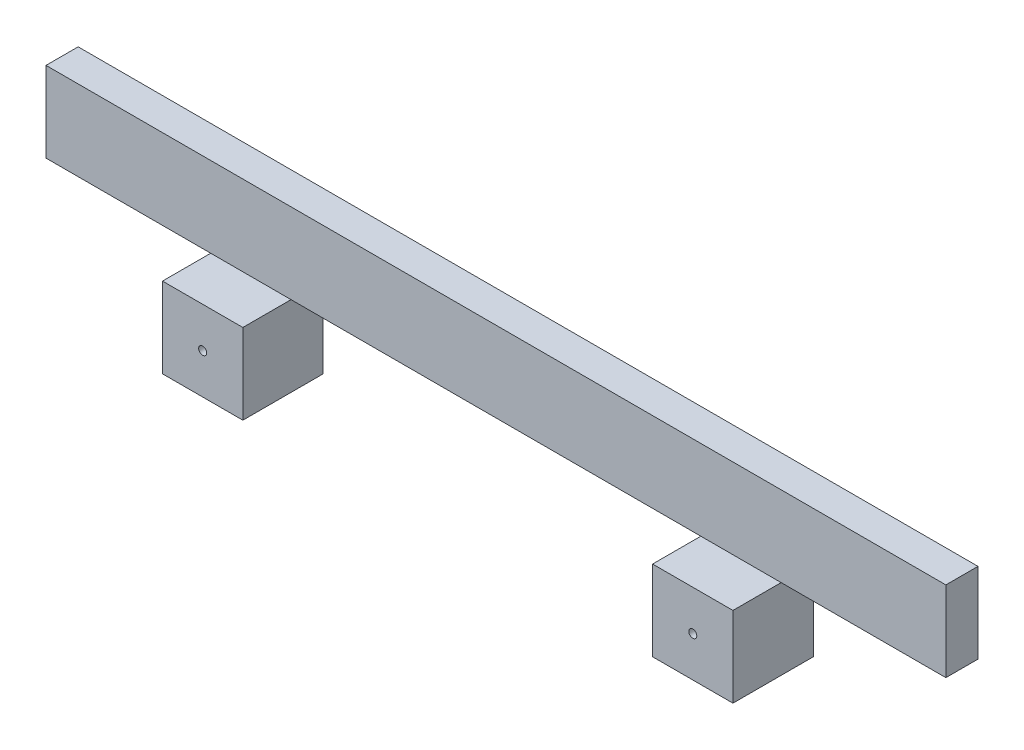
ISO-10303-21;
HEADER;
FILE_DESCRIPTION(('STEP AP214'),'2;1');
FILE_NAME('part.step','',(''),(''),'','','');
FILE_SCHEMA(('AUTOMOTIVE_DESIGN { 1 0 10303 214 1 1 1 1 }'));
ENDSEC;
DATA;
#1=APPLICATION_CONTEXT('core data for automotive mechanical design processes');
#2=APPLICATION_PROTOCOL_DEFINITION('international standard','automotive_design',2000,#1);
#3=PRODUCT_CONTEXT('',#1,'mechanical');
#4=PRODUCT('Part','Part','',(#3));
#5=PRODUCT_RELATED_PRODUCT_CATEGORY('part','',(#4));
#6=PRODUCT_DEFINITION_FORMATION('','',#4);
#7=PRODUCT_DEFINITION_CONTEXT('part definition',#1,'design');
#8=PRODUCT_DEFINITION('design','',#6,#7);
#9=PRODUCT_DEFINITION_SHAPE('','',#8);
#10=(LENGTH_UNIT() NAMED_UNIT(*) SI_UNIT(.MILLI.,.METRE.));
#11=(NAMED_UNIT(*) PLANE_ANGLE_UNIT() SI_UNIT($,.RADIAN.));
#12=(NAMED_UNIT(*) SI_UNIT($,.STERADIAN.) SOLID_ANGLE_UNIT());
#13=UNCERTAINTY_MEASURE_WITH_UNIT(LENGTH_MEASURE(1.E-05),#10,'distance_accuracy_value','');
#14=(GEOMETRIC_REPRESENTATION_CONTEXT(3) GLOBAL_UNCERTAINTY_ASSIGNED_CONTEXT((#13)) GLOBAL_UNIT_ASSIGNED_CONTEXT((#10,
#11,#12)) REPRESENTATION_CONTEXT('',''));
#15=CARTESIAN_POINT('',(0.,0.,0.));
#16=DIRECTION('',(0.,0.,1.));
#17=DIRECTION('',(1.,0.,0.));
#18=AXIS2_PLACEMENT_3D('',#15,#16,#17);
#19=CARTESIAN_POINT('',(0.,0.,10.));
#20=DIRECTION('',(0.,1.,0.));
#21=DIRECTION('',(0.,0.,1.));
#22=AXIS2_PLACEMENT_3D('',#19,#20,#21);
#23=PLANE('',#22);
#24=DIRECTION('',(0.,0.,-1.));
#25=VECTOR('',#24,1.);
#26=CARTESIAN_POINT('',(203.75,0.,25.));
#27=LINE('',#26,#25);
#28=CARTESIAN_POINT('',(203.75,0.,10.));
#29=VERTEX_POINT('',#28);
#30=CARTESIAN_POINT('',(203.75,0.,0.));
#31=VERTEX_POINT('',#30);
#32=EDGE_CURVE('E181',#29,#31,#27,.T.);
#33=ORIENTED_EDGE('',*,*,#32,.F.);
#34=DIRECTION('',(1.,0.,0.));
#35=VECTOR('',#34,1.);
#36=CARTESIAN_POINT('',(0.,0.,10.));
#37=LINE('',#36,#35);
#38=CARTESIAN_POINT('',(76.25,0.,10.));
#39=VERTEX_POINT('',#38);
#40=EDGE_CURVE('E48',#39,#29,#37,.T.);
#41=ORIENTED_EDGE('',*,*,#40,.F.);
#42=DIRECTION('',(0.,0.,-1.));
#43=VECTOR('',#42,1.);
#44=CARTESIAN_POINT('',(76.25,0.,25.));
#45=LINE('',#44,#43);
#46=CARTESIAN_POINT('',(76.25,0.,0.));
#47=VERTEX_POINT('',#46);
#48=EDGE_CURVE('E241',#39,#47,#45,.T.);
#49=ORIENTED_EDGE('',*,*,#48,.T.);
#50=DIRECTION('',(1.,0.,0.));
#51=VECTOR('',#50,1.);
#52=CARTESIAN_POINT('',(0.,0.,0.));
#53=LINE('',#52,#51);
#54=EDGE_CURVE('E200',#47,#31,#53,.T.);
#55=ORIENTED_EDGE('',*,*,#54,.T.);
#56=EDGE_LOOP('',(#33,#41,#49,#55));
#57=FACE_BOUND('',#56,.T.);
#58=ADVANCED_FACE('F35',(#57),#23,.F.);
#59=CARTESIAN_POINT('',(76.25,0.,25.));
#60=DIRECTION('',(1.,0.,0.));
#61=DIRECTION('',(0.,0.,-1.));
#62=AXIS2_PLACEMENT_3D('',#59,#60,#61);
#63=PLANE('',#62);
#64=DIRECTION('',(0.,-1.,0.));
#65=VECTOR('',#64,1.);
#66=CARTESIAN_POINT('',(76.25,0.,0.));
#67=LINE('',#66,#65);
#68=CARTESIAN_POINT('',(76.25,-25.,0.));
#69=VERTEX_POINT('',#68);
#70=EDGE_CURVE('E243',#47,#69,#67,.T.);
#71=ORIENTED_EDGE('',*,*,#70,.F.);
#72=ORIENTED_EDGE('',*,*,#48,.F.);
#73=CARTESIAN_POINT('',(76.25,0.,25.));
#74=VERTEX_POINT('',#73);
#75=EDGE_CURVE('E45',#74,#39,#45,.T.);
#76=ORIENTED_EDGE('',*,*,#75,.F.);
#77=DIRECTION('',(0.,-1.,0.));
#78=VECTOR('',#77,1.);
#79=CARTESIAN_POINT('',(76.25,0.,25.));
#80=LINE('',#79,#78);
#81=CARTESIAN_POINT('',(76.25,-25.,25.));
#82=VERTEX_POINT('',#81);
#83=EDGE_CURVE('E294',#74,#82,#80,.T.);
#84=ORIENTED_EDGE('',*,*,#83,.T.);
#85=DIRECTION('',(0.,0.,-1.));
#86=VECTOR('',#85,1.);
#87=CARTESIAN_POINT('',(76.25,-25.,25.));
#88=LINE('',#87,#86);
#89=EDGE_CURVE('E270',#82,#69,#88,.T.);
#90=ORIENTED_EDGE('',*,*,#89,.T.);
#91=EDGE_LOOP('',(#71,#72,#76,#84,#90));
#92=FACE_BOUND('',#91,.T.);
#93=ADVANCED_FACE('F315',(#92),#63,.T.);
#94=CARTESIAN_POINT('',(0.,0.,25.));
#95=DIRECTION('',(0.,1.,0.));
#96=DIRECTION('',(0.,0.,1.));
#97=AXIS2_PLACEMENT_3D('',#94,#95,#96);
#98=PLANE('',#97);
#99=CARTESIAN_POINT('',(51.25,0.,10.));
#100=VERTEX_POINT('',#99);
#101=EDGE_CURVE('E11',#100,#39,#37,.T.);
#102=ORIENTED_EDGE('',*,*,#101,.F.);
#103=DIRECTION('',(0.,0.,-1.));
#104=VECTOR('',#103,1.);
#105=CARTESIAN_POINT('',(51.25,0.,25.));
#106=LINE('',#105,#104);
#107=CARTESIAN_POINT('',(51.25,0.,25.));
#108=VERTEX_POINT('',#107);
#109=EDGE_CURVE('E265',#108,#100,#106,.T.);
#110=ORIENTED_EDGE('',*,*,#109,.F.);
#111=DIRECTION('',(1.,0.,0.));
#112=VECTOR('',#111,1.);
#113=CARTESIAN_POINT('',(0.,0.,25.));
#114=LINE('',#113,#112);
#115=EDGE_CURVE('E291',#108,#74,#114,.T.);
#116=ORIENTED_EDGE('',*,*,#115,.T.);
#117=ORIENTED_EDGE('',*,*,#75,.T.);
#118=EDGE_LOOP('',(#102,#110,#116,#117));
#119=FACE_BOUND('',#118,.T.);
#120=ADVANCED_FACE('F310',(#119),#98,.T.);
#121=CARTESIAN_POINT('',(51.25,0.,25.));
#122=DIRECTION('',(1.,0.,0.));
#123=DIRECTION('',(0.,1.,0.));
#124=AXIS2_PLACEMENT_3D('',#121,#122,#123);
#125=PLANE('',#124);
#126=DIRECTION('',(0.,-1.,0.));
#127=VECTOR('',#126,1.);
#128=CARTESIAN_POINT('',(51.25,0.,0.));
#129=LINE('',#128,#127);
#130=CARTESIAN_POINT('',(51.25,0.,0.));
#131=VERTEX_POINT('',#130);
#132=CARTESIAN_POINT('',(51.25,-25.,0.));
#133=VERTEX_POINT('',#132);
#134=EDGE_CURVE('E275',#131,#133,#129,.T.);
#135=ORIENTED_EDGE('',*,*,#134,.T.);
#136=DIRECTION('',(0.,0.,-1.));
#137=VECTOR('',#136,1.);
#138=CARTESIAN_POINT('',(51.25,-25.,25.));
#139=LINE('',#138,#137);
#140=CARTESIAN_POINT('',(51.25,-25.,25.));
#141=VERTEX_POINT('',#140);
#142=EDGE_CURVE('E266',#141,#133,#139,.T.);
#143=ORIENTED_EDGE('',*,*,#142,.F.);
#144=DIRECTION('',(0.,-1.,0.));
#145=VECTOR('',#144,1.);
#146=CARTESIAN_POINT('',(51.25,0.,25.));
#147=LINE('',#146,#145);
#148=EDGE_CURVE('E288',#108,#141,#147,.T.);
#149=ORIENTED_EDGE('',*,*,#148,.F.);
#150=ORIENTED_EDGE('',*,*,#109,.T.);
#151=EDGE_CURVE('E261',#100,#131,#106,.T.);
#152=ORIENTED_EDGE('',*,*,#151,.T.);
#153=EDGE_LOOP('',(#135,#143,#149,#150,#152));
#154=FACE_BOUND('',#153,.T.);
#155=ADVANCED_FACE('F313',(#154),#125,.F.);
#156=CARTESIAN_POINT('',(63.75,-12.5,25.));
#157=DIRECTION('',(0.,0.,-1.));
#158=DIRECTION('',(-1.,0.,0.));
#159=AXIS2_PLACEMENT_3D('',#156,#157,#158);
#160=CYLINDRICAL_SURFACE('',#159,1.25);
#161=CARTESIAN_POINT('',(63.75,-12.5,25.));
#162=DIRECTION('',(0.,0.,1.));
#163=DIRECTION('',(1.,0.,0.));
#164=AXIS2_PLACEMENT_3D('',#161,#162,#163);
#165=CIRCLE('',#164,1.25);
#166=CARTESIAN_POINT('',(65.,-12.5,25.));
#167=VERTEX_POINT('',#166);
#168=EDGE_CURVE('E284',#167,#167,#165,.T.);
#169=ORIENTED_EDGE('',*,*,#168,.T.);
#170=EDGE_LOOP('',(#169));
#171=FACE_BOUND('',#170,.T.);
#172=CARTESIAN_POINT('',(63.75,-12.5,0.));
#173=DIRECTION('',(0.,0.,1.));
#174=DIRECTION('',(1.,0.,0.));
#175=AXIS2_PLACEMENT_3D('',#172,#173,#174);
#176=CIRCLE('',#175,1.25);
#177=CARTESIAN_POINT('',(65.,-12.5,0.));
#178=VERTEX_POINT('',#177);
#179=EDGE_CURVE('E209',#178,#178,#176,.T.);
#180=ORIENTED_EDGE('',*,*,#179,.F.);
#181=EDGE_LOOP('',(#180));
#182=FACE_BOUND('',#181,.T.);
#183=ADVANCED_FACE('F37',(#171,#182),#160,.F.);
#184=CARTESIAN_POINT('',(0.,-25.,25.));
#185=DIRECTION('',(0.,1.,0.));
#186=DIRECTION('',(-1.,0.,0.));
#187=AXIS2_PLACEMENT_3D('',#184,#185,#186);
#188=PLANE('',#187);
#189=DIRECTION('',(1.,0.,0.));
#190=VECTOR('',#189,1.);
#191=CARTESIAN_POINT('',(0.,-25.,0.));
#192=LINE('',#191,#190);
#193=EDGE_CURVE('E281',#133,#69,#192,.T.);
#194=ORIENTED_EDGE('',*,*,#193,.T.);
#195=ORIENTED_EDGE('',*,*,#89,.F.);
#196=DIRECTION('',(1.,0.,0.));
#197=VECTOR('',#196,1.);
#198=CARTESIAN_POINT('',(0.,-25.,25.));
#199=LINE('',#198,#197);
#200=EDGE_CURVE('E280',#141,#82,#199,.T.);
#201=ORIENTED_EDGE('',*,*,#200,.F.);
#202=ORIENTED_EDGE('',*,*,#142,.T.);
#203=EDGE_LOOP('',(#194,#195,#201,#202));
#204=FACE_BOUND('',#203,.T.);
#205=ADVANCED_FACE('F304',(#204),#188,.F.);
#206=CARTESIAN_POINT('',(0.,0.,25.));
#207=DIRECTION('',(0.,0.,1.));
#208=DIRECTION('',(1.,0.,0.));
#209=AXIS2_PLACEMENT_3D('',#206,#207,#208);
#210=PLANE('',#209);
#211=ORIENTED_EDGE('',*,*,#168,.F.);
#212=EDGE_LOOP('',(#211));
#213=FACE_BOUND('',#212,.T.);
#214=ORIENTED_EDGE('',*,*,#83,.F.);
#215=ORIENTED_EDGE('',*,*,#115,.F.);
#216=ORIENTED_EDGE('',*,*,#148,.T.);
#217=ORIENTED_EDGE('',*,*,#200,.T.);
#218=EDGE_LOOP('',(#214,#215,#216,#217));
#219=FACE_BOUND('',#218,.T.);
#220=ADVANCED_FACE('F301',(#213,#219),#210,.T.);
#221=CARTESIAN_POINT('',(0.,0.,0.));
#222=DIRECTION('',(0.,0.,1.));
#223=DIRECTION('',(1.,0.,0.));
#224=AXIS2_PLACEMENT_3D('',#221,#222,#223);
#225=PLANE('',#224);
#226=ORIENTED_EDGE('',*,*,#179,.T.);
#227=EDGE_LOOP('',(#226));
#228=FACE_BOUND('',#227,.T.);
#229=ORIENTED_EDGE('',*,*,#70,.T.);
#230=ORIENTED_EDGE('',*,*,#193,.F.);
#231=ORIENTED_EDGE('',*,*,#134,.F.);
#232=CARTESIAN_POINT('',(0.,0.,0.));
#233=VERTEX_POINT('',#232);
#234=EDGE_CURVE('E203',#233,#131,#53,.T.);
#235=ORIENTED_EDGE('',*,*,#234,.F.);
#236=DIRECTION('',(0.,1.,0.));
#237=VECTOR('',#236,1.);
#238=CARTESIAN_POINT('',(0.,0.,0.));
#239=LINE('',#238,#237);
#240=CARTESIAN_POINT('',(0.,25.,0.));
#241=VERTEX_POINT('',#240);
#242=EDGE_CURVE('E215',#233,#241,#239,.T.);
#243=ORIENTED_EDGE('',*,*,#242,.T.);
#244=DIRECTION('',(1.,0.,0.));
#245=VECTOR('',#244,1.);
#246=CARTESIAN_POINT('',(0.,25.,0.));
#247=LINE('',#246,#245);
#248=CARTESIAN_POINT('',(280.,25.,0.));
#249=VERTEX_POINT('',#248);
#250=EDGE_CURVE('E217',#241,#249,#247,.T.);
#251=ORIENTED_EDGE('',*,*,#250,.T.);
#252=DIRECTION('',(0.,1.,0.));
#253=VECTOR('',#252,1.);
#254=CARTESIAN_POINT('',(280.,0.,0.));
#255=LINE('',#254,#253);
#256=CARTESIAN_POINT('',(280.,0.,0.));
#257=VERTEX_POINT('',#256);
#258=EDGE_CURVE('E195',#257,#249,#255,.T.);
#259=ORIENTED_EDGE('',*,*,#258,.F.);
#260=CARTESIAN_POINT('',(228.75,0.,0.));
#261=VERTEX_POINT('',#260);
#262=EDGE_CURVE('E39',#261,#257,#53,.T.);
#263=ORIENTED_EDGE('',*,*,#262,.F.);
#264=DIRECTION('',(0.,-1.,0.));
#265=VECTOR('',#264,1.);
#266=CARTESIAN_POINT('',(228.75,0.,0.));
#267=LINE('',#266,#265);
#268=CARTESIAN_POINT('',(228.75,-25.,0.));
#269=VERTEX_POINT('',#268);
#270=EDGE_CURVE('E168',#261,#269,#267,.T.);
#271=ORIENTED_EDGE('',*,*,#270,.T.);
#272=DIRECTION('',(1.,0.,0.));
#273=VECTOR('',#272,1.);
#274=CARTESIAN_POINT('',(0.,-25.,0.));
#275=LINE('',#274,#273);
#276=CARTESIAN_POINT('',(203.75,-25.,0.));
#277=VERTEX_POINT('',#276);
#278=EDGE_CURVE('E174',#277,#269,#275,.T.);
#279=ORIENTED_EDGE('',*,*,#278,.F.);
#280=DIRECTION('',(0.,-1.,0.));
#281=VECTOR('',#280,1.);
#282=CARTESIAN_POINT('',(203.75,0.,0.));
#283=LINE('',#282,#281);
#284=EDGE_CURVE('E171',#31,#277,#283,.T.);
#285=ORIENTED_EDGE('',*,*,#284,.F.);
#286=ORIENTED_EDGE('',*,*,#54,.F.);
#287=EDGE_LOOP('',(#229,#230,#231,#235,#243,#251,#259,#263,#271,#279,#285,#286));
#288=FACE_BOUND('',#287,.T.);
#289=CARTESIAN_POINT('',(216.25,-12.5,0.));
#290=DIRECTION('',(0.,0.,1.));
#291=DIRECTION('',(1.,0.,0.));
#292=AXIS2_PLACEMENT_3D('',#289,#290,#291);
#293=CIRCLE('',#292,1.25000000000001);
#294=CARTESIAN_POINT('',(217.5,-12.5,0.));
#295=VERTEX_POINT('',#294);
#296=EDGE_CURVE('E165',#295,#295,#293,.T.);
#297=ORIENTED_EDGE('',*,*,#296,.T.);
#298=EDGE_LOOP('',(#297));
#299=FACE_BOUND('',#298,.T.);
#300=ADVANCED_FACE('F230',(#228,#288,#299),#225,.F.);
#301=CARTESIAN_POINT('',(228.75,0.,10.));
#302=VERTEX_POINT('',#301);
#303=CARTESIAN_POINT('',(280.,0.,10.));
#304=VERTEX_POINT('',#303);
#305=EDGE_CURVE('E185',#302,#304,#37,.T.);
#306=ORIENTED_EDGE('',*,*,#305,.F.);
#307=DIRECTION('',(0.,0.,-1.));
#308=VECTOR('',#307,1.);
#309=CARTESIAN_POINT('',(228.75,0.,25.));
#310=LINE('',#309,#308);
#311=EDGE_CURVE('E142',#302,#261,#310,.T.);
#312=ORIENTED_EDGE('',*,*,#311,.T.);
#313=ORIENTED_EDGE('',*,*,#262,.T.);
#314=DIRECTION('',(0.,0.,-1.));
#315=VECTOR('',#314,1.);
#316=CARTESIAN_POINT('',(280.,0.,10.));
#317=LINE('',#316,#315);
#318=EDGE_CURVE('E206',#304,#257,#317,.T.);
#319=ORIENTED_EDGE('',*,*,#318,.F.);
#320=EDGE_LOOP('',(#306,#312,#313,#319));
#321=FACE_BOUND('',#320,.T.);
#322=ADVANCED_FACE('F249',(#321),#23,.F.);
#323=ORIENTED_EDGE('',*,*,#151,.F.);
#324=CARTESIAN_POINT('',(0.,0.,10.));
#325=VERTEX_POINT('',#324);
#326=EDGE_CURVE('E47',#325,#100,#37,.T.);
#327=ORIENTED_EDGE('',*,*,#326,.F.);
#328=DIRECTION('',(0.,0.,-1.));
#329=VECTOR('',#328,1.);
#330=CARTESIAN_POINT('',(0.,0.,10.));
#331=LINE('',#330,#329);
#332=EDGE_CURVE('E192',#325,#233,#331,.T.);
#333=ORIENTED_EDGE('',*,*,#332,.T.);
#334=ORIENTED_EDGE('',*,*,#234,.T.);
#335=EDGE_LOOP('',(#323,#327,#333,#334));
#336=FACE_BOUND('',#335,.T.);
#337=ADVANCED_FACE('F259',(#336),#23,.F.);
#338=CARTESIAN_POINT('',(280.,0.,10.));
#339=DIRECTION('',(-1.,0.,0.));
#340=DIRECTION('',(0.,0.,1.));
#341=AXIS2_PLACEMENT_3D('',#338,#339,#340);
#342=PLANE('',#341);
#343=ORIENTED_EDGE('',*,*,#258,.T.);
#344=DIRECTION('',(0.,0.,-1.));
#345=VECTOR('',#344,1.);
#346=CARTESIAN_POINT('',(280.,25.,10.));
#347=LINE('',#346,#345);
#348=CARTESIAN_POINT('',(280.,25.,10.));
#349=VERTEX_POINT('',#348);
#350=EDGE_CURVE('E210',#349,#249,#347,.T.);
#351=ORIENTED_EDGE('',*,*,#350,.F.);
#352=DIRECTION('',(0.,1.,0.));
#353=VECTOR('',#352,1.);
#354=CARTESIAN_POINT('',(280.,0.,10.));
#355=LINE('',#354,#353);
#356=EDGE_CURVE('E184',#304,#349,#355,.T.);
#357=ORIENTED_EDGE('',*,*,#356,.F.);
#358=ORIENTED_EDGE('',*,*,#318,.T.);
#359=EDGE_LOOP('',(#343,#351,#357,#358));
#360=FACE_BOUND('',#359,.T.);
#361=ADVANCED_FACE('F225',(#360),#342,.F.);
#362=CARTESIAN_POINT('',(0.,25.,10.));
#363=DIRECTION('',(0.,1.,0.));
#364=DIRECTION('',(0.,0.,1.));
#365=AXIS2_PLACEMENT_3D('',#362,#363,#364);
#366=PLANE('',#365);
#367=ORIENTED_EDGE('',*,*,#250,.F.);
#368=DIRECTION('',(0.,0.,-1.));
#369=VECTOR('',#368,1.);
#370=CARTESIAN_POINT('',(0.,25.,10.));
#371=LINE('',#370,#369);
#372=CARTESIAN_POINT('',(0.,25.,10.));
#373=VERTEX_POINT('',#372);
#374=EDGE_CURVE('E212',#373,#241,#371,.T.);
#375=ORIENTED_EDGE('',*,*,#374,.F.);
#376=DIRECTION('',(1.,0.,0.));
#377=VECTOR('',#376,1.);
#378=CARTESIAN_POINT('',(0.,25.,10.));
#379=LINE('',#378,#377);
#380=EDGE_CURVE('E187',#373,#349,#379,.T.);
#381=ORIENTED_EDGE('',*,*,#380,.T.);
#382=ORIENTED_EDGE('',*,*,#350,.T.);
#383=EDGE_LOOP('',(#367,#375,#381,#382));
#384=FACE_BOUND('',#383,.T.);
#385=ADVANCED_FACE('F338',(#384),#366,.T.);
#386=CARTESIAN_POINT('',(0.,0.,10.));
#387=DIRECTION('',(-1.,0.,0.));
#388=DIRECTION('',(0.,0.,1.));
#389=AXIS2_PLACEMENT_3D('',#386,#387,#388);
#390=PLANE('',#389);
#391=ORIENTED_EDGE('',*,*,#242,.F.);
#392=ORIENTED_EDGE('',*,*,#332,.F.);
#393=DIRECTION('',(0.,1.,0.));
#394=VECTOR('',#393,1.);
#395=CARTESIAN_POINT('',(0.,0.,10.));
#396=LINE('',#395,#394);
#397=EDGE_CURVE('E190',#325,#373,#396,.T.);
#398=ORIENTED_EDGE('',*,*,#397,.T.);
#399=ORIENTED_EDGE('',*,*,#374,.T.);
#400=EDGE_LOOP('',(#391,#392,#398,#399));
#401=FACE_BOUND('',#400,.T.);
#402=ADVANCED_FACE('F341',(#401),#390,.T.);
#403=CARTESIAN_POINT('',(0.,0.,10.));
#404=DIRECTION('',(0.,0.,1.));
#405=DIRECTION('',(1.,0.,0.));
#406=AXIS2_PLACEMENT_3D('',#403,#404,#405);
#407=PLANE('',#406);
#408=ORIENTED_EDGE('',*,*,#326,.T.);
#409=ORIENTED_EDGE('',*,*,#101,.T.);
#410=ORIENTED_EDGE('',*,*,#40,.T.);
#411=EDGE_CURVE('E252',#29,#302,#37,.T.);
#412=ORIENTED_EDGE('',*,*,#411,.T.);
#413=ORIENTED_EDGE('',*,*,#305,.T.);
#414=ORIENTED_EDGE('',*,*,#356,.T.);
#415=ORIENTED_EDGE('',*,*,#380,.F.);
#416=ORIENTED_EDGE('',*,*,#397,.F.);
#417=EDGE_LOOP('',(#408,#409,#410,#412,#413,#414,#415,#416));
#418=FACE_BOUND('',#417,.T.);
#419=ADVANCED_FACE('F253',(#418),#407,.T.);
#420=CARTESIAN_POINT('',(228.75,0.,25.));
#421=DIRECTION('',(1.,0.,0.));
#422=DIRECTION('',(0.,0.,-1.));
#423=AXIS2_PLACEMENT_3D('',#420,#421,#422);
#424=PLANE('',#423);
#425=ORIENTED_EDGE('',*,*,#270,.F.);
#426=ORIENTED_EDGE('',*,*,#311,.F.);
#427=CARTESIAN_POINT('',(228.75,0.,25.));
#428=VERTEX_POINT('',#427);
#429=EDGE_CURVE('E55',#428,#302,#310,.T.);
#430=ORIENTED_EDGE('',*,*,#429,.F.);
#431=DIRECTION('',(0.,-1.,0.));
#432=VECTOR('',#431,1.);
#433=CARTESIAN_POINT('',(228.75,0.,25.));
#434=LINE('',#433,#432);
#435=CARTESIAN_POINT('',(228.75,-25.,25.));
#436=VERTEX_POINT('',#435);
#437=EDGE_CURVE('E140',#428,#436,#434,.T.);
#438=ORIENTED_EDGE('',*,*,#437,.T.);
#439=DIRECTION('',(0.,0.,-1.));
#440=VECTOR('',#439,1.);
#441=CARTESIAN_POINT('',(228.75,-25.,25.));
#442=LINE('',#441,#440);
#443=EDGE_CURVE('E164',#436,#269,#442,.T.);
#444=ORIENTED_EDGE('',*,*,#443,.T.);
#445=EDGE_LOOP('',(#425,#426,#430,#438,#444));
#446=FACE_BOUND('',#445,.T.);
#447=ADVANCED_FACE('F139',(#446),#424,.T.);
#448=CARTESIAN_POINT('',(0.,0.,25.));
#449=DIRECTION('',(0.,1.,0.));
#450=DIRECTION('',(0.,0.,1.));
#451=AXIS2_PLACEMENT_3D('',#448,#449,#450);
#452=PLANE('',#451);
#453=ORIENTED_EDGE('',*,*,#429,.T.);
#454=ORIENTED_EDGE('',*,*,#411,.F.);
#455=CARTESIAN_POINT('',(203.75,0.,25.));
#456=VERTEX_POINT('',#455);
#457=EDGE_CURVE('E156',#456,#29,#27,.T.);
#458=ORIENTED_EDGE('',*,*,#457,.F.);
#459=DIRECTION('',(1.,0.,0.));
#460=VECTOR('',#459,1.);
#461=CARTESIAN_POINT('',(0.,0.,25.));
#462=LINE('',#461,#460);
#463=EDGE_CURVE('E149',#456,#428,#462,.T.);
#464=ORIENTED_EDGE('',*,*,#463,.T.);
#465=EDGE_LOOP('',(#453,#454,#458,#464));
#466=FACE_BOUND('',#465,.T.);
#467=ADVANCED_FACE('F154',(#466),#452,.T.);
#468=CARTESIAN_POINT('',(203.75,0.,25.));
#469=DIRECTION('',(1.,0.,0.));
#470=DIRECTION('',(0.,0.,-1.));
#471=AXIS2_PLACEMENT_3D('',#468,#469,#470);
#472=PLANE('',#471);
#473=ORIENTED_EDGE('',*,*,#284,.T.);
#474=DIRECTION('',(0.,0.,-1.));
#475=VECTOR('',#474,1.);
#476=CARTESIAN_POINT('',(203.75,-25.,25.));
#477=LINE('',#476,#475);
#478=CARTESIAN_POINT('',(203.75,-25.,25.));
#479=VERTEX_POINT('',#478);
#480=EDGE_CURVE('E178',#479,#277,#477,.T.);
#481=ORIENTED_EDGE('',*,*,#480,.F.);
#482=DIRECTION('',(0.,-1.,0.));
#483=VECTOR('',#482,1.);
#484=CARTESIAN_POINT('',(203.75,0.,25.));
#485=LINE('',#484,#483);
#486=EDGE_CURVE('E158',#456,#479,#485,.T.);
#487=ORIENTED_EDGE('',*,*,#486,.F.);
#488=ORIENTED_EDGE('',*,*,#457,.T.);
#489=ORIENTED_EDGE('',*,*,#32,.T.);
#490=EDGE_LOOP('',(#473,#481,#487,#488,#489));
#491=FACE_BOUND('',#490,.T.);
#492=ADVANCED_FACE('F246',(#491),#472,.F.);
#493=CARTESIAN_POINT('',(216.25,-12.5,25.));
#494=DIRECTION('',(0.,0.,-1.));
#495=DIRECTION('',(-1.,0.,0.));
#496=AXIS2_PLACEMENT_3D('',#493,#494,#495);
#497=CYLINDRICAL_SURFACE('',#496,1.25000000000001);
#498=CARTESIAN_POINT('',(216.25,-12.5,25.));
#499=DIRECTION('',(0.,0.,1.));
#500=DIRECTION('',(1.,0.,0.));
#501=AXIS2_PLACEMENT_3D('',#498,#499,#500);
#502=CIRCLE('',#501,1.25000000000001);
#503=CARTESIAN_POINT('',(217.5,-12.5,25.));
#504=VERTEX_POINT('',#503);
#505=EDGE_CURVE('E152',#504,#504,#502,.T.);
#506=ORIENTED_EDGE('',*,*,#505,.T.);
#507=EDGE_LOOP('',(#506));
#508=FACE_BOUND('',#507,.T.);
#509=ORIENTED_EDGE('',*,*,#296,.F.);
#510=EDGE_LOOP('',(#509));
#511=FACE_BOUND('',#510,.T.);
#512=ADVANCED_FACE('F348',(#508,#511),#497,.F.);
#513=CARTESIAN_POINT('',(0.,-25.,25.));
#514=DIRECTION('',(0.,1.,0.));
#515=DIRECTION('',(0.,0.,1.));
#516=AXIS2_PLACEMENT_3D('',#513,#514,#515);
#517=PLANE('',#516);
#518=ORIENTED_EDGE('',*,*,#278,.T.);
#519=ORIENTED_EDGE('',*,*,#443,.F.);
#520=DIRECTION('',(1.,0.,0.));
#521=VECTOR('',#520,1.);
#522=CARTESIAN_POINT('',(0.,-25.,25.));
#523=LINE('',#522,#521);
#524=EDGE_CURVE('E150',#479,#436,#523,.T.);
#525=ORIENTED_EDGE('',*,*,#524,.F.);
#526=ORIENTED_EDGE('',*,*,#480,.T.);
#527=EDGE_LOOP('',(#518,#519,#525,#526));
#528=FACE_BOUND('',#527,.T.);
#529=ADVANCED_FACE('F248',(#528),#517,.F.);
#530=CARTESIAN_POINT('',(0.,0.,25.));
#531=DIRECTION('',(0.,0.,1.));
#532=DIRECTION('',(1.,0.,0.));
#533=AXIS2_PLACEMENT_3D('',#530,#531,#532);
#534=PLANE('',#533);
#535=ORIENTED_EDGE('',*,*,#505,.F.);
#536=EDGE_LOOP('',(#535));
#537=FACE_BOUND('',#536,.T.);
#538=ORIENTED_EDGE('',*,*,#437,.F.);
#539=ORIENTED_EDGE('',*,*,#463,.F.);
#540=ORIENTED_EDGE('',*,*,#486,.T.);
#541=ORIENTED_EDGE('',*,*,#524,.T.);
#542=EDGE_LOOP('',(#538,#539,#540,#541));
#543=FACE_BOUND('',#542,.T.);
#544=ADVANCED_FACE('F147',(#537,#543),#534,.T.);
#545=CLOSED_SHELL('',(#58,#93,#120,#155,#183,#205,#220,#300,#322,#337,#361,#385,#402,#419,#447,
#467,#492,#512,#529,#544));
#546=MANIFOLD_SOLID_BREP('B2',#545);
#547=ADVANCED_BREP_SHAPE_REPRESENTATION('',(#18,#546),#14);
#548=SHAPE_DEFINITION_REPRESENTATION(#9,#547);
ENDSEC;
END-ISO-10303-21;
